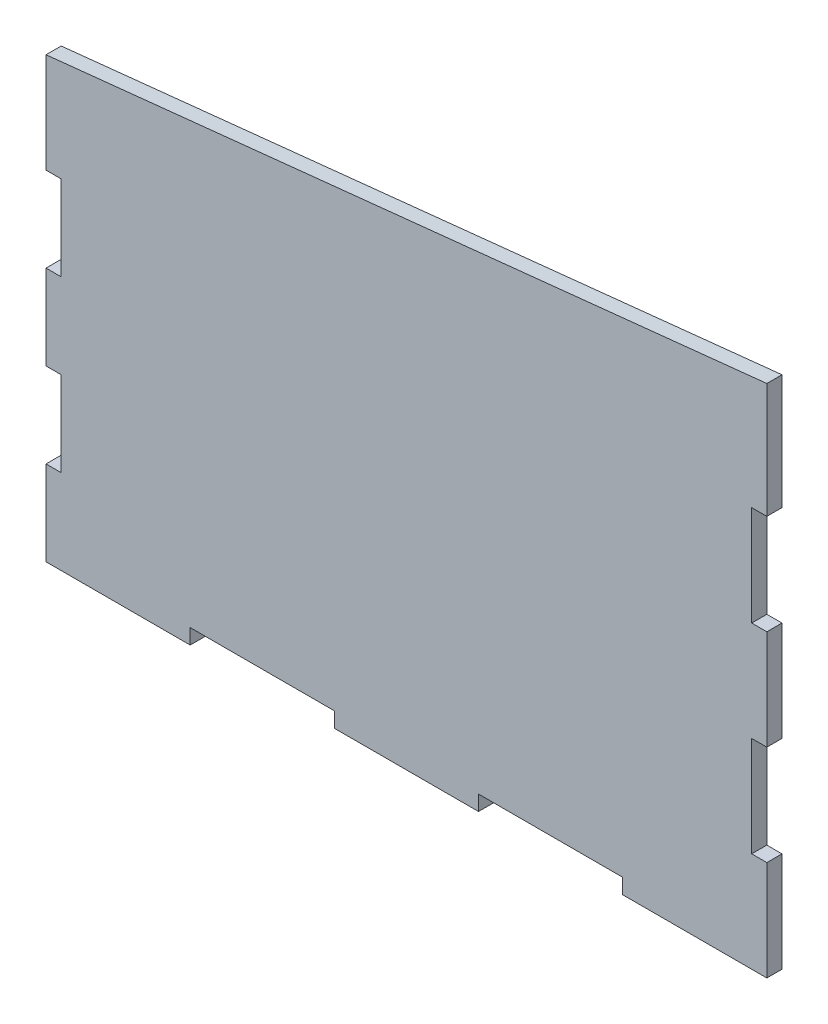
ISO-10303-21;
HEADER;
FILE_DESCRIPTION(('STEP AP214'),'2;1');
FILE_NAME('part.step','',(''),(''),'','','');
FILE_SCHEMA(('AUTOMOTIVE_DESIGN { 1 0 10303 214 1 1 1 1 }'));
ENDSEC;
DATA;
#1=APPLICATION_CONTEXT('core data for automotive mechanical design processes');
#2=APPLICATION_PROTOCOL_DEFINITION('international standard','automotive_design',2000,#1);
#3=PRODUCT_CONTEXT('',#1,'mechanical');
#4=PRODUCT('Part','Part','',(#3));
#5=PRODUCT_RELATED_PRODUCT_CATEGORY('part','',(#4));
#6=PRODUCT_DEFINITION_FORMATION('','',#4);
#7=PRODUCT_DEFINITION_CONTEXT('part definition',#1,'design');
#8=PRODUCT_DEFINITION('design','',#6,#7);
#9=PRODUCT_DEFINITION_SHAPE('','',#8);
#10=(LENGTH_UNIT() NAMED_UNIT(*) SI_UNIT(.MILLI.,.METRE.));
#11=(NAMED_UNIT(*) PLANE_ANGLE_UNIT() SI_UNIT($,.RADIAN.));
#12=(NAMED_UNIT(*) SI_UNIT($,.STERADIAN.) SOLID_ANGLE_UNIT());
#13=UNCERTAINTY_MEASURE_WITH_UNIT(LENGTH_MEASURE(1.E-05),#10,'distance_accuracy_value','');
#14=(GEOMETRIC_REPRESENTATION_CONTEXT(3) GLOBAL_UNCERTAINTY_ASSIGNED_CONTEXT((#13)) GLOBAL_UNIT_ASSIGNED_CONTEXT((#10,
#11,#12)) REPRESENTATION_CONTEXT('',''));
#15=CARTESIAN_POINT('',(0.,0.,0.));
#16=DIRECTION('',(0.,0.,1.));
#17=DIRECTION('',(1.,0.,0.));
#18=AXIS2_PLACEMENT_3D('',#15,#16,#17);
#19=CARTESIAN_POINT('',(0.,0.,5.));
#20=DIRECTION('',(1.,0.,0.));
#21=DIRECTION('',(0.,0.,-1.));
#22=AXIS2_PLACEMENT_3D('',#19,#20,#21);
#23=PLANE('',#22);
#24=DIRECTION('',(0.,-1.,0.));
#25=VECTOR('',#24,1.);
#26=CARTESIAN_POINT('',(0.,0.,0.));
#27=LINE('',#26,#25);
#28=CARTESIAN_POINT('',(0.,145.,0.));
#29=VERTEX_POINT('',#28);
#30=CARTESIAN_POINT('',(0.,112.,0.));
#31=VERTEX_POINT('',#30);
#32=EDGE_CURVE('E245',#29,#31,#27,.T.);
#33=ORIENTED_EDGE('',*,*,#32,.T.);
#34=DIRECTION('',(0.,0.,1.));
#35=VECTOR('',#34,1.);
#36=CARTESIAN_POINT('',(0.,112.,0.));
#37=LINE('',#36,#35);
#38=CARTESIAN_POINT('',(0.,112.,5.));
#39=VERTEX_POINT('',#38);
#40=EDGE_CURVE('E432',#31,#39,#37,.T.);
#41=ORIENTED_EDGE('',*,*,#40,.T.);
#42=DIRECTION('',(0.,-1.,0.));
#43=VECTOR('',#42,1.);
#44=CARTESIAN_POINT('',(0.,0.,5.));
#45=LINE('',#44,#43);
#46=CARTESIAN_POINT('',(0.,145.,5.));
#47=VERTEX_POINT('',#46);
#48=EDGE_CURVE('E258',#47,#39,#45,.T.);
#49=ORIENTED_EDGE('',*,*,#48,.F.);
#50=DIRECTION('',(0.,0.,-1.));
#51=VECTOR('',#50,1.);
#52=CARTESIAN_POINT('',(0.,145.,5.));
#53=LINE('',#52,#51);
#54=EDGE_CURVE('E257',#47,#29,#53,.T.);
#55=ORIENTED_EDGE('',*,*,#54,.T.);
#56=EDGE_LOOP('',(#33,#41,#49,#55));
#57=FACE_BOUND('',#56,.T.);
#58=ADVANCED_FACE('F35',(#57),#23,.F.);
#59=CARTESIAN_POINT('',(238.,0.,5.));
#60=DIRECTION('',(0.,1.,0.));
#61=DIRECTION('',(-1.,0.,0.));
#62=AXIS2_PLACEMENT_3D('',#59,#60,#61);
#63=PLANE('',#62);
#64=DIRECTION('',(1.,0.,0.));
#65=VECTOR('',#64,1.);
#66=CARTESIAN_POINT('',(238.,0.,0.));
#67=LINE('',#66,#65);
#68=CARTESIAN_POINT('',(0.,0.,0.));
#69=VERTEX_POINT('',#68);
#70=CARTESIAN_POINT('',(47.6,0.,0.));
#71=VERTEX_POINT('',#70);
#72=EDGE_CURVE('E282',#69,#71,#67,.T.);
#73=ORIENTED_EDGE('',*,*,#72,.T.);
#74=DIRECTION('',(0.,0.,1.));
#75=VECTOR('',#74,1.);
#76=CARTESIAN_POINT('',(47.6,0.,0.));
#77=LINE('',#76,#75);
#78=CARTESIAN_POINT('',(47.6,0.,5.));
#79=VERTEX_POINT('',#78);
#80=EDGE_CURVE('E336',#71,#79,#77,.T.);
#81=ORIENTED_EDGE('',*,*,#80,.T.);
#82=DIRECTION('',(1.,0.,0.));
#83=VECTOR('',#82,1.);
#84=CARTESIAN_POINT('',(238.,0.,5.));
#85=LINE('',#84,#83);
#86=CARTESIAN_POINT('',(0.,0.,5.));
#87=VERTEX_POINT('',#86);
#88=EDGE_CURVE('E308',#87,#79,#85,.T.);
#89=ORIENTED_EDGE('',*,*,#88,.F.);
#90=DIRECTION('',(0.,0.,-1.));
#91=VECTOR('',#90,1.);
#92=CARTESIAN_POINT('',(0.,0.,5.));
#93=LINE('',#92,#91);
#94=EDGE_CURVE('E254',#87,#69,#93,.T.);
#95=ORIENTED_EDGE('',*,*,#94,.T.);
#96=EDGE_LOOP('',(#73,#81,#89,#95));
#97=FACE_BOUND('',#96,.T.);
#98=ADVANCED_FACE('F335',(#97),#63,.F.);
#99=CARTESIAN_POINT('',(95.2,0.,5.));
#100=VERTEX_POINT('',#99);
#101=CARTESIAN_POINT('',(142.8,0.,5.));
#102=VERTEX_POINT('',#101);
#103=EDGE_CURVE('E312',#100,#102,#85,.T.);
#104=ORIENTED_EDGE('',*,*,#103,.F.);
#105=DIRECTION('',(0.,0.,1.));
#106=VECTOR('',#105,1.);
#107=CARTESIAN_POINT('',(95.2,0.,0.));
#108=LINE('',#107,#106);
#109=CARTESIAN_POINT('',(95.2,0.,0.));
#110=VERTEX_POINT('',#109);
#111=EDGE_CURVE('E340',#110,#100,#108,.T.);
#112=ORIENTED_EDGE('',*,*,#111,.F.);
#113=CARTESIAN_POINT('',(142.8,0.,0.));
#114=VERTEX_POINT('',#113);
#115=EDGE_CURVE('E285',#110,#114,#67,.T.);
#116=ORIENTED_EDGE('',*,*,#115,.T.);
#117=DIRECTION('',(0.,0.,1.));
#118=VECTOR('',#117,1.);
#119=CARTESIAN_POINT('',(142.8,0.,0.));
#120=LINE('',#119,#118);
#121=EDGE_CURVE('E358',#114,#102,#120,.T.);
#122=ORIENTED_EDGE('',*,*,#121,.T.);
#123=EDGE_LOOP('',(#104,#112,#116,#122));
#124=FACE_BOUND('',#123,.T.);
#125=ADVANCED_FACE('F477',(#124),#63,.F.);
#126=CARTESIAN_POINT('',(238.,170.,5.));
#127=DIRECTION('',(-1.,0.,0.));
#128=DIRECTION('',(0.,-1.,0.));
#129=AXIS2_PLACEMENT_3D('',#126,#127,#128);
#130=PLANE('',#129);
#131=DIRECTION('',(0.,1.,0.));
#132=VECTOR('',#131,1.);
#133=CARTESIAN_POINT('',(238.,170.,0.));
#134=LINE('',#133,#132);
#135=CARTESIAN_POINT('',(238.,66.,0.));
#136=VERTEX_POINT('',#135);
#137=CARTESIAN_POINT('',(238.,99.,0.));
#138=VERTEX_POINT('',#137);
#139=EDGE_CURVE('E276',#136,#138,#134,.T.);
#140=ORIENTED_EDGE('',*,*,#139,.T.);
#141=DIRECTION('',(0.,0.,1.));
#142=VECTOR('',#141,1.);
#143=CARTESIAN_POINT('',(238.,99.,0.));
#144=LINE('',#143,#142);
#145=CARTESIAN_POINT('',(238.,99.,5.));
#146=VERTEX_POINT('',#145);
#147=EDGE_CURVE('E362',#138,#146,#144,.T.);
#148=ORIENTED_EDGE('',*,*,#147,.T.);
#149=DIRECTION('',(0.,1.,0.));
#150=VECTOR('',#149,1.);
#151=CARTESIAN_POINT('',(238.,5.00000000000005,5.));
#152=LINE('',#151,#150);
#153=CARTESIAN_POINT('',(238.,66.,5.));
#154=VERTEX_POINT('',#153);
#155=EDGE_CURVE('E316',#154,#146,#152,.T.);
#156=ORIENTED_EDGE('',*,*,#155,.F.);
#157=DIRECTION('',(0.,0.,1.));
#158=VECTOR('',#157,1.);
#159=CARTESIAN_POINT('',(238.,66.,0.));
#160=LINE('',#159,#158);
#161=EDGE_CURVE('E420',#136,#154,#160,.T.);
#162=ORIENTED_EDGE('',*,*,#161,.F.);
#163=EDGE_LOOP('',(#140,#148,#156,#162));
#164=FACE_BOUND('',#163,.T.);
#165=ADVANCED_FACE('F490',(#164),#130,.F.);
#166=CARTESIAN_POINT('',(238.,132.,5.));
#167=VERTEX_POINT('',#166);
#168=CARTESIAN_POINT('',(238.,170.,5.));
#169=VERTEX_POINT('',#168);
#170=EDGE_CURVE('E311',#167,#169,#152,.T.);
#171=ORIENTED_EDGE('',*,*,#170,.F.);
#172=DIRECTION('',(0.,0.,1.));
#173=VECTOR('',#172,1.);
#174=CARTESIAN_POINT('',(238.,132.,0.));
#175=LINE('',#174,#173);
#176=CARTESIAN_POINT('',(238.,132.,0.));
#177=VERTEX_POINT('',#176);
#178=EDGE_CURVE('E385',#177,#167,#175,.T.);
#179=ORIENTED_EDGE('',*,*,#178,.F.);
#180=CARTESIAN_POINT('',(238.,170.,0.));
#181=VERTEX_POINT('',#180);
#182=EDGE_CURVE('E273',#177,#181,#134,.T.);
#183=ORIENTED_EDGE('',*,*,#182,.T.);
#184=DIRECTION('',(0.,0.,-1.));
#185=VECTOR('',#184,1.);
#186=CARTESIAN_POINT('',(238.,170.,5.));
#187=LINE('',#186,#185);
#188=EDGE_CURVE('E43',#169,#181,#187,.T.);
#189=ORIENTED_EDGE('',*,*,#188,.F.);
#190=EDGE_LOOP('',(#171,#179,#183,#189));
#191=FACE_BOUND('',#190,.T.);
#192=ADVANCED_FACE('F491',(#191),#130,.F.);
#193=CARTESIAN_POINT('',(0.,84.,5.));
#194=VERTEX_POINT('',#193);
#195=CARTESIAN_POINT('',(0.,56.,5.));
#196=VERTEX_POINT('',#195);
#197=EDGE_CURVE('E236',#194,#196,#45,.T.);
#198=ORIENTED_EDGE('',*,*,#197,.F.);
#199=DIRECTION('',(0.,0.,1.));
#200=VECTOR('',#199,1.);
#201=CARTESIAN_POINT('',(0.,84.,0.));
#202=LINE('',#201,#200);
#203=CARTESIAN_POINT('',(0.,84.,0.));
#204=VERTEX_POINT('',#203);
#205=EDGE_CURVE('E223',#204,#194,#202,.T.);
#206=ORIENTED_EDGE('',*,*,#205,.F.);
#207=CARTESIAN_POINT('',(0.,56.,0.));
#208=VERTEX_POINT('',#207);
#209=EDGE_CURVE('E234',#204,#208,#27,.T.);
#210=ORIENTED_EDGE('',*,*,#209,.T.);
#211=DIRECTION('',(0.,0.,1.));
#212=VECTOR('',#211,1.);
#213=CARTESIAN_POINT('',(0.,56.,0.));
#214=LINE('',#213,#212);
#215=EDGE_CURVE('E292',#208,#196,#214,.T.);
#216=ORIENTED_EDGE('',*,*,#215,.T.);
#217=EDGE_LOOP('',(#198,#206,#210,#216));
#218=FACE_BOUND('',#217,.T.);
#219=ADVANCED_FACE('F232',(#218),#23,.F.);
#220=CARTESIAN_POINT('',(190.4,0.,5.));
#221=VERTEX_POINT('',#220);
#222=CARTESIAN_POINT('',(238.,0.,5.));
#223=VERTEX_POINT('',#222);
#224=EDGE_CURVE('E249',#221,#223,#85,.T.);
#225=ORIENTED_EDGE('',*,*,#224,.F.);
#226=DIRECTION('',(0.,0.,1.));
#227=VECTOR('',#226,1.);
#228=CARTESIAN_POINT('',(190.4,0.,0.));
#229=LINE('',#228,#227);
#230=CARTESIAN_POINT('',(190.4,0.,0.));
#231=VERTEX_POINT('',#230);
#232=EDGE_CURVE('E372',#231,#221,#229,.T.);
#233=ORIENTED_EDGE('',*,*,#232,.F.);
#234=CARTESIAN_POINT('',(238.,0.,0.));
#235=VERTEX_POINT('',#234);
#236=EDGE_CURVE('E286',#231,#235,#67,.T.);
#237=ORIENTED_EDGE('',*,*,#236,.T.);
#238=DIRECTION('',(0.,0.,-1.));
#239=VECTOR('',#238,1.);
#240=CARTESIAN_POINT('',(238.,0.,5.));
#241=LINE('',#240,#239);
#242=EDGE_CURVE('E11',#223,#235,#241,.T.);
#243=ORIENTED_EDGE('',*,*,#242,.F.);
#244=EDGE_LOOP('',(#225,#233,#237,#243));
#245=FACE_BOUND('',#244,.T.);
#246=ADVANCED_FACE('F37',(#245),#63,.F.);
#247=CARTESIAN_POINT('',(238.,33.,0.));
#248=VERTEX_POINT('',#247);
#249=EDGE_CURVE('E274',#235,#248,#134,.T.);
#250=ORIENTED_EDGE('',*,*,#249,.T.);
#251=DIRECTION('',(0.,0.,1.));
#252=VECTOR('',#251,1.);
#253=CARTESIAN_POINT('',(238.,33.,0.));
#254=LINE('',#253,#252);
#255=CARTESIAN_POINT('',(238.,33.,5.));
#256=VERTEX_POINT('',#255);
#257=EDGE_CURVE('E422',#248,#256,#254,.T.);
#258=ORIENTED_EDGE('',*,*,#257,.T.);
#259=EDGE_CURVE('E313',#223,#256,#152,.T.);
#260=ORIENTED_EDGE('',*,*,#259,.F.);
#261=ORIENTED_EDGE('',*,*,#242,.T.);
#262=EDGE_LOOP('',(#250,#258,#260,#261));
#263=FACE_BOUND('',#262,.T.);
#264=ADVANCED_FACE('F484',(#263),#130,.F.);
#265=CARTESIAN_POINT('',(0.,145.,5.));
#266=DIRECTION('',(0.10446726114149,-0.994528326066983,0.));
#267=DIRECTION('',(0.994528326066983,0.10446726114149,0.));
#268=AXIS2_PLACEMENT_3D('',#265,#266,#267);
#269=PLANE('',#268);
#270=DIRECTION('',(-0.994528326066983,-0.10446726114149,0.));
#271=VECTOR('',#270,1.);
#272=CARTESIAN_POINT('',(0.,145.,0.));
#273=LINE('',#272,#271);
#274=EDGE_CURVE('E250',#181,#29,#273,.T.);
#275=ORIENTED_EDGE('',*,*,#274,.T.);
#276=ORIENTED_EDGE('',*,*,#54,.F.);
#277=DIRECTION('',(-0.994528326066983,-0.10446726114149,0.));
#278=VECTOR('',#277,1.);
#279=CARTESIAN_POINT('',(0.,145.,5.));
#280=LINE('',#279,#278);
#281=EDGE_CURVE('E267',#169,#47,#280,.T.);
#282=ORIENTED_EDGE('',*,*,#281,.F.);
#283=ORIENTED_EDGE('',*,*,#188,.T.);
#284=EDGE_LOOP('',(#275,#276,#282,#283));
#285=FACE_BOUND('',#284,.T.);
#286=ADVANCED_FACE('F265',(#285),#269,.F.);
#287=CARTESIAN_POINT('',(0.,28.,5.));
#288=VERTEX_POINT('',#287);
#289=EDGE_CURVE('E317',#288,#87,#45,.T.);
#290=ORIENTED_EDGE('',*,*,#289,.F.);
#291=DIRECTION('',(0.,0.,1.));
#292=VECTOR('',#291,1.);
#293=CARTESIAN_POINT('',(0.,28.,0.));
#294=LINE('',#293,#292);
#295=CARTESIAN_POINT('',(0.,28.,0.));
#296=VERTEX_POINT('',#295);
#297=EDGE_CURVE('E306',#296,#288,#294,.T.);
#298=ORIENTED_EDGE('',*,*,#297,.F.);
#299=EDGE_CURVE('E246',#296,#69,#27,.T.);
#300=ORIENTED_EDGE('',*,*,#299,.T.);
#301=ORIENTED_EDGE('',*,*,#94,.F.);
#302=EDGE_LOOP('',(#290,#298,#300,#301));
#303=FACE_BOUND('',#302,.T.);
#304=ADVANCED_FACE('F333',(#303),#23,.F.);
#305=CARTESIAN_POINT('',(0.,0.,5.));
#306=DIRECTION('',(0.,0.,-1.));
#307=DIRECTION('',(-1.,0.,0.));
#308=AXIS2_PLACEMENT_3D('',#305,#306,#307);
#309=PLANE('',#308);
#310=ORIENTED_EDGE('',*,*,#48,.T.);
#311=DIRECTION('',(-1.,0.,0.));
#312=VECTOR('',#311,1.);
#313=CARTESIAN_POINT('',(0.,112.,5.));
#314=LINE('',#313,#312);
#315=CARTESIAN_POINT('',(5.,112.,5.));
#316=VERTEX_POINT('',#315);
#317=EDGE_CURVE('E228',#316,#39,#314,.T.);
#318=ORIENTED_EDGE('',*,*,#317,.F.);
#319=DIRECTION('',(0.,1.,0.));
#320=VECTOR('',#319,1.);
#321=CARTESIAN_POINT('',(5.,84.,5.));
#322=LINE('',#321,#320);
#323=CARTESIAN_POINT('',(5.,84.,5.));
#324=VERTEX_POINT('',#323);
#325=EDGE_CURVE('E442',#324,#316,#322,.T.);
#326=ORIENTED_EDGE('',*,*,#325,.F.);
#327=DIRECTION('',(1.,0.,0.));
#328=VECTOR('',#327,1.);
#329=CARTESIAN_POINT('',(0.,84.,5.));
#330=LINE('',#329,#328);
#331=EDGE_CURVE('E440',#194,#324,#330,.T.);
#332=ORIENTED_EDGE('',*,*,#331,.F.);
#333=ORIENTED_EDGE('',*,*,#197,.T.);
#334=DIRECTION('',(-1.,0.,0.));
#335=VECTOR('',#334,1.);
#336=CARTESIAN_POINT('',(0.,56.,5.));
#337=LINE('',#336,#335);
#338=CARTESIAN_POINT('',(5.,56.,5.));
#339=VERTEX_POINT('',#338);
#340=EDGE_CURVE('E302',#339,#196,#337,.T.);
#341=ORIENTED_EDGE('',*,*,#340,.F.);
#342=DIRECTION('',(0.,1.,0.));
#343=VECTOR('',#342,1.);
#344=CARTESIAN_POINT('',(5.,28.,5.));
#345=LINE('',#344,#343);
#346=CARTESIAN_POINT('',(5.,28.,5.));
#347=VERTEX_POINT('',#346);
#348=EDGE_CURVE('E431',#347,#339,#345,.T.);
#349=ORIENTED_EDGE('',*,*,#348,.F.);
#350=DIRECTION('',(1.,0.,0.));
#351=VECTOR('',#350,1.);
#352=CARTESIAN_POINT('',(0.,28.,5.));
#353=LINE('',#352,#351);
#354=EDGE_CURVE('E330',#288,#347,#353,.T.);
#355=ORIENTED_EDGE('',*,*,#354,.F.);
#356=ORIENTED_EDGE('',*,*,#289,.T.);
#357=ORIENTED_EDGE('',*,*,#88,.T.);
#358=DIRECTION('',(0.,-1.,0.));
#359=VECTOR('',#358,1.);
#360=CARTESIAN_POINT('',(47.6,0.,5.));
#361=LINE('',#360,#359);
#362=CARTESIAN_POINT('',(47.6,5.,5.));
#363=VERTEX_POINT('',#362);
#364=EDGE_CURVE('E369',#363,#79,#361,.T.);
#365=ORIENTED_EDGE('',*,*,#364,.F.);
#366=DIRECTION('',(-1.,0.,0.));
#367=VECTOR('',#366,1.);
#368=CARTESIAN_POINT('',(47.6,5.,5.));
#369=LINE('',#368,#367);
#370=CARTESIAN_POINT('',(95.2,5.,5.));
#371=VERTEX_POINT('',#370);
#372=EDGE_CURVE('E458',#371,#363,#369,.T.);
#373=ORIENTED_EDGE('',*,*,#372,.F.);
#374=DIRECTION('',(0.,1.,0.));
#375=VECTOR('',#374,1.);
#376=CARTESIAN_POINT('',(95.2,0.,5.));
#377=LINE('',#376,#375);
#378=EDGE_CURVE('E462',#100,#371,#377,.T.);
#379=ORIENTED_EDGE('',*,*,#378,.F.);
#380=ORIENTED_EDGE('',*,*,#103,.T.);
#381=DIRECTION('',(0.,-1.,0.));
#382=VECTOR('',#381,1.);
#383=CARTESIAN_POINT('',(142.8,0.,5.));
#384=LINE('',#383,#382);
#385=CARTESIAN_POINT('',(142.8,5.,5.));
#386=VERTEX_POINT('',#385);
#387=EDGE_CURVE('E359',#386,#102,#384,.T.);
#388=ORIENTED_EDGE('',*,*,#387,.F.);
#389=DIRECTION('',(-1.,0.,0.));
#390=VECTOR('',#389,1.);
#391=CARTESIAN_POINT('',(142.8,5.,5.));
#392=LINE('',#391,#390);
#393=CARTESIAN_POINT('',(190.4,5.,5.));
#394=VERTEX_POINT('',#393);
#395=EDGE_CURVE('E352',#394,#386,#392,.T.);
#396=ORIENTED_EDGE('',*,*,#395,.F.);
#397=DIRECTION('',(0.,1.,0.));
#398=VECTOR('',#397,1.);
#399=CARTESIAN_POINT('',(190.4,0.,5.));
#400=LINE('',#399,#398);
#401=EDGE_CURVE('E361',#221,#394,#400,.T.);
#402=ORIENTED_EDGE('',*,*,#401,.F.);
#403=ORIENTED_EDGE('',*,*,#224,.T.);
#404=ORIENTED_EDGE('',*,*,#259,.T.);
#405=DIRECTION('',(1.,0.,0.));
#406=VECTOR('',#405,1.);
#407=CARTESIAN_POINT('',(233.,33.,5.));
#408=LINE('',#407,#406);
#409=CARTESIAN_POINT('',(233.,33.,5.));
#410=VERTEX_POINT('',#409);
#411=EDGE_CURVE('E415',#410,#256,#408,.T.);
#412=ORIENTED_EDGE('',*,*,#411,.F.);
#413=DIRECTION('',(0.,-1.,0.));
#414=VECTOR('',#413,1.);
#415=CARTESIAN_POINT('',(233.,33.,5.));
#416=LINE('',#415,#414);
#417=CARTESIAN_POINT('',(233.,66.,5.));
#418=VERTEX_POINT('',#417);
#419=EDGE_CURVE('E412',#418,#410,#416,.T.);
#420=ORIENTED_EDGE('',*,*,#419,.F.);
#421=DIRECTION('',(-1.,0.,0.));
#422=VECTOR('',#421,1.);
#423=CARTESIAN_POINT('',(233.,66.,5.));
#424=LINE('',#423,#422);
#425=EDGE_CURVE('E405',#154,#418,#424,.T.);
#426=ORIENTED_EDGE('',*,*,#425,.F.);
#427=ORIENTED_EDGE('',*,*,#155,.T.);
#428=DIRECTION('',(1.,0.,0.));
#429=VECTOR('',#428,1.);
#430=CARTESIAN_POINT('',(238.,99.,5.));
#431=LINE('',#430,#429);
#432=CARTESIAN_POINT('',(233.,99.,5.));
#433=VERTEX_POINT('',#432);
#434=EDGE_CURVE('E379',#433,#146,#431,.T.);
#435=ORIENTED_EDGE('',*,*,#434,.F.);
#436=DIRECTION('',(0.,-1.,0.));
#437=VECTOR('',#436,1.);
#438=CARTESIAN_POINT('',(233.,132.,5.));
#439=LINE('',#438,#437);
#440=CARTESIAN_POINT('',(233.,132.,5.));
#441=VERTEX_POINT('',#440);
#442=EDGE_CURVE('E389',#441,#433,#439,.T.);
#443=ORIENTED_EDGE('',*,*,#442,.F.);
#444=DIRECTION('',(-1.,0.,0.));
#445=VECTOR('',#444,1.);
#446=CARTESIAN_POINT('',(238.,132.,5.));
#447=LINE('',#446,#445);
#448=EDGE_CURVE('E386',#167,#441,#447,.T.);
#449=ORIENTED_EDGE('',*,*,#448,.F.);
#450=ORIENTED_EDGE('',*,*,#170,.T.);
#451=ORIENTED_EDGE('',*,*,#281,.T.);
#452=EDGE_LOOP('',(#310,#318,#326,#332,#333,#341,#349,#355,#356,#357,#365,#373,#379,#380,#388,
#396,#402,#403,#404,#412,#420,#426,#427,#435,#443,#449,#450,#451));
#453=FACE_BOUND('',#452,.T.);
#454=ADVANCED_FACE('F325',(#453),#309,.F.);
#455=CARTESIAN_POINT('',(0.,0.,0.));
#456=DIRECTION('',(0.,0.,-1.));
#457=DIRECTION('',(-1.,0.,0.));
#458=AXIS2_PLACEMENT_3D('',#455,#456,#457);
#459=PLANE('',#458);
#460=DIRECTION('',(-1.,0.,0.));
#461=VECTOR('',#460,1.);
#462=CARTESIAN_POINT('',(0.,112.,0.));
#463=LINE('',#462,#461);
#464=CARTESIAN_POINT('',(5.,112.,0.));
#465=VERTEX_POINT('',#464);
#466=EDGE_CURVE('E237',#465,#31,#463,.T.);
#467=ORIENTED_EDGE('',*,*,#466,.T.);
#468=ORIENTED_EDGE('',*,*,#32,.F.);
#469=ORIENTED_EDGE('',*,*,#274,.F.);
#470=ORIENTED_EDGE('',*,*,#182,.F.);
#471=DIRECTION('',(-1.,0.,0.));
#472=VECTOR('',#471,1.);
#473=CARTESIAN_POINT('',(238.,132.,0.));
#474=LINE('',#473,#472);
#475=CARTESIAN_POINT('',(233.,132.,0.));
#476=VERTEX_POINT('',#475);
#477=EDGE_CURVE('E376',#177,#476,#474,.T.);
#478=ORIENTED_EDGE('',*,*,#477,.T.);
#479=DIRECTION('',(0.,-1.,0.));
#480=VECTOR('',#479,1.);
#481=CARTESIAN_POINT('',(233.,132.,0.));
#482=LINE('',#481,#480);
#483=CARTESIAN_POINT('',(233.,99.,0.));
#484=VERTEX_POINT('',#483);
#485=EDGE_CURVE('E378',#476,#484,#482,.T.);
#486=ORIENTED_EDGE('',*,*,#485,.T.);
#487=DIRECTION('',(1.,0.,0.));
#488=VECTOR('',#487,1.);
#489=CARTESIAN_POINT('',(238.,99.,0.));
#490=LINE('',#489,#488);
#491=EDGE_CURVE('E382',#484,#138,#490,.T.);
#492=ORIENTED_EDGE('',*,*,#491,.T.);
#493=ORIENTED_EDGE('',*,*,#139,.F.);
#494=DIRECTION('',(-1.,0.,0.));
#495=VECTOR('',#494,1.);
#496=CARTESIAN_POINT('',(233.,66.,0.));
#497=LINE('',#496,#495);
#498=CARTESIAN_POINT('',(233.,66.,0.));
#499=VERTEX_POINT('',#498);
#500=EDGE_CURVE('E408',#136,#499,#497,.T.);
#501=ORIENTED_EDGE('',*,*,#500,.T.);
#502=DIRECTION('',(0.,-1.,0.));
#503=VECTOR('',#502,1.);
#504=CARTESIAN_POINT('',(233.,33.,0.));
#505=LINE('',#504,#503);
#506=CARTESIAN_POINT('',(233.,33.,0.));
#507=VERTEX_POINT('',#506);
#508=EDGE_CURVE('E401',#499,#507,#505,.T.);
#509=ORIENTED_EDGE('',*,*,#508,.T.);
#510=DIRECTION('',(1.,0.,0.));
#511=VECTOR('',#510,1.);
#512=CARTESIAN_POINT('',(233.,33.,0.));
#513=LINE('',#512,#511);
#514=EDGE_CURVE('E404',#507,#248,#513,.T.);
#515=ORIENTED_EDGE('',*,*,#514,.T.);
#516=ORIENTED_EDGE('',*,*,#249,.F.);
#517=ORIENTED_EDGE('',*,*,#236,.F.);
#518=DIRECTION('',(0.,1.,0.));
#519=VECTOR('',#518,1.);
#520=CARTESIAN_POINT('',(190.4,0.,0.));
#521=LINE('',#520,#519);
#522=CARTESIAN_POINT('',(190.4,5.,0.));
#523=VERTEX_POINT('',#522);
#524=EDGE_CURVE('E351',#231,#523,#521,.T.);
#525=ORIENTED_EDGE('',*,*,#524,.T.);
#526=DIRECTION('',(-1.,0.,0.));
#527=VECTOR('',#526,1.);
#528=CARTESIAN_POINT('',(142.8,5.,0.));
#529=LINE('',#528,#527);
#530=CARTESIAN_POINT('',(142.8,5.,0.));
#531=VERTEX_POINT('',#530);
#532=EDGE_CURVE('E355',#523,#531,#529,.T.);
#533=ORIENTED_EDGE('',*,*,#532,.T.);
#534=DIRECTION('',(0.,-1.,0.));
#535=VECTOR('',#534,1.);
#536=CARTESIAN_POINT('',(142.8,0.,0.));
#537=LINE('',#536,#535);
#538=EDGE_CURVE('E348',#531,#114,#537,.T.);
#539=ORIENTED_EDGE('',*,*,#538,.T.);
#540=ORIENTED_EDGE('',*,*,#115,.F.);
#541=DIRECTION('',(0.,1.,0.));
#542=VECTOR('',#541,1.);
#543=CARTESIAN_POINT('',(95.2,0.,0.));
#544=LINE('',#543,#542);
#545=CARTESIAN_POINT('',(95.2,5.,0.));
#546=VERTEX_POINT('',#545);
#547=EDGE_CURVE('E344',#110,#546,#544,.T.);
#548=ORIENTED_EDGE('',*,*,#547,.T.);
#549=DIRECTION('',(-1.,0.,0.));
#550=VECTOR('',#549,1.);
#551=CARTESIAN_POINT('',(47.6,5.,0.));
#552=LINE('',#551,#550);
#553=CARTESIAN_POINT('',(47.6,5.,0.));
#554=VERTEX_POINT('',#553);
#555=EDGE_CURVE('E58',#546,#554,#552,.T.);
#556=ORIENTED_EDGE('',*,*,#555,.T.);
#557=DIRECTION('',(0.,-1.,0.));
#558=VECTOR('',#557,1.);
#559=CARTESIAN_POINT('',(47.6,0.,0.));
#560=LINE('',#559,#558);
#561=EDGE_CURVE('E456',#554,#71,#560,.T.);
#562=ORIENTED_EDGE('',*,*,#561,.T.);
#563=ORIENTED_EDGE('',*,*,#72,.F.);
#564=ORIENTED_EDGE('',*,*,#299,.F.);
#565=DIRECTION('',(1.,0.,0.));
#566=VECTOR('',#565,1.);
#567=CARTESIAN_POINT('',(0.,28.,0.));
#568=LINE('',#567,#566);
#569=CARTESIAN_POINT('',(5.,28.,0.));
#570=VERTEX_POINT('',#569);
#571=EDGE_CURVE('E425',#296,#570,#568,.T.);
#572=ORIENTED_EDGE('',*,*,#571,.T.);
#573=DIRECTION('',(0.,1.,0.));
#574=VECTOR('',#573,1.);
#575=CARTESIAN_POINT('',(5.,28.,0.));
#576=LINE('',#575,#574);
#577=CARTESIAN_POINT('',(5.,56.,0.));
#578=VERTEX_POINT('',#577);
#579=EDGE_CURVE('E428',#570,#578,#576,.T.);
#580=ORIENTED_EDGE('',*,*,#579,.T.);
#581=DIRECTION('',(-1.,0.,0.));
#582=VECTOR('',#581,1.);
#583=CARTESIAN_POINT('',(0.,56.,0.));
#584=LINE('',#583,#582);
#585=EDGE_CURVE('E244',#578,#208,#584,.T.);
#586=ORIENTED_EDGE('',*,*,#585,.T.);
#587=ORIENTED_EDGE('',*,*,#209,.F.);
#588=DIRECTION('',(1.,0.,0.));
#589=VECTOR('',#588,1.);
#590=CARTESIAN_POINT('',(0.,84.,0.));
#591=LINE('',#590,#589);
#592=CARTESIAN_POINT('',(5.,84.,0.));
#593=VERTEX_POINT('',#592);
#594=EDGE_CURVE('E219',#204,#593,#591,.T.);
#595=ORIENTED_EDGE('',*,*,#594,.T.);
#596=DIRECTION('',(0.,1.,0.));
#597=VECTOR('',#596,1.);
#598=CARTESIAN_POINT('',(5.,84.,0.));
#599=LINE('',#598,#597);
#600=EDGE_CURVE('E50',#593,#465,#599,.T.);
#601=ORIENTED_EDGE('',*,*,#600,.T.);
#602=EDGE_LOOP('',(#467,#468,#469,#470,#478,#486,#492,#493,#501,#509,#515,#516,#517,#525,#533,
#539,#540,#548,#556,#562,#563,#564,#572,#580,#586,#587,#595,#601));
#603=FACE_BOUND('',#602,.T.);
#604=ADVANCED_FACE('F241',(#603),#459,.T.);
#605=CARTESIAN_POINT('',(0.,56.,0.));
#606=DIRECTION('',(0.,1.,0.));
#607=DIRECTION('',(0.,0.,1.));
#608=AXIS2_PLACEMENT_3D('',#605,#606,#607);
#609=PLANE('',#608);
#610=ORIENTED_EDGE('',*,*,#340,.T.);
#611=ORIENTED_EDGE('',*,*,#215,.F.);
#612=ORIENTED_EDGE('',*,*,#585,.F.);
#613=DIRECTION('',(0.,0.,1.));
#614=VECTOR('',#613,1.);
#615=CARTESIAN_POINT('',(5.,56.,0.));
#616=LINE('',#615,#614);
#617=EDGE_CURVE('E297',#578,#339,#616,.T.);
#618=ORIENTED_EDGE('',*,*,#617,.T.);
#619=EDGE_LOOP('',(#610,#611,#612,#618));
#620=FACE_BOUND('',#619,.T.);
#621=ADVANCED_FACE('F438',(#620),#609,.F.);
#622=CARTESIAN_POINT('',(5.,28.,0.));
#623=DIRECTION('',(1.,0.,0.));
#624=DIRECTION('',(0.,0.,-1.));
#625=AXIS2_PLACEMENT_3D('',#622,#623,#624);
#626=PLANE('',#625);
#627=ORIENTED_EDGE('',*,*,#348,.T.);
#628=ORIENTED_EDGE('',*,*,#617,.F.);
#629=ORIENTED_EDGE('',*,*,#579,.F.);
#630=DIRECTION('',(0.,0.,1.));
#631=VECTOR('',#630,1.);
#632=CARTESIAN_POINT('',(5.,28.,0.));
#633=LINE('',#632,#631);
#634=EDGE_CURVE('E299',#570,#347,#633,.T.);
#635=ORIENTED_EDGE('',*,*,#634,.T.);
#636=EDGE_LOOP('',(#627,#628,#629,#635));
#637=FACE_BOUND('',#636,.T.);
#638=ADVANCED_FACE('F544',(#637),#626,.F.);
#639=CARTESIAN_POINT('',(0.,28.,0.));
#640=DIRECTION('',(0.,-1.,0.));
#641=DIRECTION('',(0.,0.,-1.));
#642=AXIS2_PLACEMENT_3D('',#639,#640,#641);
#643=PLANE('',#642);
#644=ORIENTED_EDGE('',*,*,#354,.T.);
#645=ORIENTED_EDGE('',*,*,#634,.F.);
#646=ORIENTED_EDGE('',*,*,#571,.F.);
#647=ORIENTED_EDGE('',*,*,#297,.T.);
#648=EDGE_LOOP('',(#644,#645,#646,#647));
#649=FACE_BOUND('',#648,.T.);
#650=ADVANCED_FACE('F554',(#649),#643,.F.);
#651=CARTESIAN_POINT('',(233.,33.,0.));
#652=DIRECTION('',(-1.,0.,0.));
#653=DIRECTION('',(0.,0.,1.));
#654=AXIS2_PLACEMENT_3D('',#651,#652,#653);
#655=PLANE('',#654);
#656=ORIENTED_EDGE('',*,*,#419,.T.);
#657=DIRECTION('',(0.,0.,1.));
#658=VECTOR('',#657,1.);
#659=CARTESIAN_POINT('',(233.,33.,0.));
#660=LINE('',#659,#658);
#661=EDGE_CURVE('E411',#507,#410,#660,.T.);
#662=ORIENTED_EDGE('',*,*,#661,.F.);
#663=ORIENTED_EDGE('',*,*,#508,.F.);
#664=DIRECTION('',(0.,0.,1.));
#665=VECTOR('',#664,1.);
#666=CARTESIAN_POINT('',(233.,66.,0.));
#667=LINE('',#666,#665);
#668=EDGE_CURVE('E390',#499,#418,#667,.T.);
#669=ORIENTED_EDGE('',*,*,#668,.T.);
#670=EDGE_LOOP('',(#656,#662,#663,#669));
#671=FACE_BOUND('',#670,.T.);
#672=ADVANCED_FACE('F563',(#671),#655,.F.);
#673=CARTESIAN_POINT('',(233.,66.,0.));
#674=DIRECTION('',(0.,1.,0.));
#675=DIRECTION('',(0.,0.,1.));
#676=AXIS2_PLACEMENT_3D('',#673,#674,#675);
#677=PLANE('',#676);
#678=ORIENTED_EDGE('',*,*,#425,.T.);
#679=ORIENTED_EDGE('',*,*,#668,.F.);
#680=ORIENTED_EDGE('',*,*,#500,.F.);
#681=ORIENTED_EDGE('',*,*,#161,.T.);
#682=EDGE_LOOP('',(#678,#679,#680,#681));
#683=FACE_BOUND('',#682,.T.);
#684=ADVANCED_FACE('F573',(#683),#677,.F.);
#685=CARTESIAN_POINT('',(233.,33.,0.));
#686=DIRECTION('',(0.,-1.,0.));
#687=DIRECTION('',(0.,0.,-1.));
#688=AXIS2_PLACEMENT_3D('',#685,#686,#687);
#689=PLANE('',#688);
#690=ORIENTED_EDGE('',*,*,#411,.T.);
#691=ORIENTED_EDGE('',*,*,#257,.F.);
#692=ORIENTED_EDGE('',*,*,#514,.F.);
#693=ORIENTED_EDGE('',*,*,#661,.T.);
#694=EDGE_LOOP('',(#690,#691,#692,#693));
#695=FACE_BOUND('',#694,.T.);
#696=ADVANCED_FACE('F583',(#695),#689,.F.);
#697=CARTESIAN_POINT('',(238.,99.,0.));
#698=DIRECTION('',(0.,-1.,0.));
#699=DIRECTION('',(0.,0.,-1.));
#700=AXIS2_PLACEMENT_3D('',#697,#698,#699);
#701=PLANE('',#700);
#702=ORIENTED_EDGE('',*,*,#434,.T.);
#703=ORIENTED_EDGE('',*,*,#147,.F.);
#704=ORIENTED_EDGE('',*,*,#491,.F.);
#705=DIRECTION('',(0.,0.,1.));
#706=VECTOR('',#705,1.);
#707=CARTESIAN_POINT('',(233.,99.,0.));
#708=LINE('',#707,#706);
#709=EDGE_CURVE('E396',#484,#433,#708,.T.);
#710=ORIENTED_EDGE('',*,*,#709,.T.);
#711=EDGE_LOOP('',(#702,#703,#704,#710));
#712=FACE_BOUND('',#711,.T.);
#713=ADVANCED_FACE('F593',(#712),#701,.F.);
#714=CARTESIAN_POINT('',(233.,132.,0.));
#715=DIRECTION('',(-1.,0.,0.));
#716=DIRECTION('',(0.,0.,1.));
#717=AXIS2_PLACEMENT_3D('',#714,#715,#716);
#718=PLANE('',#717);
#719=ORIENTED_EDGE('',*,*,#442,.T.);
#720=ORIENTED_EDGE('',*,*,#709,.F.);
#721=ORIENTED_EDGE('',*,*,#485,.F.);
#722=DIRECTION('',(0.,0.,1.));
#723=VECTOR('',#722,1.);
#724=CARTESIAN_POINT('',(233.,132.,0.));
#725=LINE('',#724,#723);
#726=EDGE_CURVE('E398',#476,#441,#725,.T.);
#727=ORIENTED_EDGE('',*,*,#726,.T.);
#728=EDGE_LOOP('',(#719,#720,#721,#727));
#729=FACE_BOUND('',#728,.T.);
#730=ADVANCED_FACE('F603',(#729),#718,.F.);
#731=CARTESIAN_POINT('',(238.,132.,0.));
#732=DIRECTION('',(0.,1.,0.));
#733=DIRECTION('',(0.,0.,1.));
#734=AXIS2_PLACEMENT_3D('',#731,#732,#733);
#735=PLANE('',#734);
#736=ORIENTED_EDGE('',*,*,#448,.T.);
#737=ORIENTED_EDGE('',*,*,#726,.F.);
#738=ORIENTED_EDGE('',*,*,#477,.F.);
#739=ORIENTED_EDGE('',*,*,#178,.T.);
#740=EDGE_LOOP('',(#736,#737,#738,#739));
#741=FACE_BOUND('',#740,.T.);
#742=ADVANCED_FACE('F613',(#741),#735,.F.);
#743=CARTESIAN_POINT('',(142.8,0.,0.));
#744=DIRECTION('',(-1.,0.,0.));
#745=DIRECTION('',(0.,0.,1.));
#746=AXIS2_PLACEMENT_3D('',#743,#744,#745);
#747=PLANE('',#746);
#748=ORIENTED_EDGE('',*,*,#387,.T.);
#749=ORIENTED_EDGE('',*,*,#121,.F.);
#750=ORIENTED_EDGE('',*,*,#538,.F.);
#751=DIRECTION('',(0.,0.,1.));
#752=VECTOR('',#751,1.);
#753=CARTESIAN_POINT('',(142.8,5.,0.));
#754=LINE('',#753,#752);
#755=EDGE_CURVE('E367',#531,#386,#754,.T.);
#756=ORIENTED_EDGE('',*,*,#755,.T.);
#757=EDGE_LOOP('',(#748,#749,#750,#756));
#758=FACE_BOUND('',#757,.T.);
#759=ADVANCED_FACE('F623',(#758),#747,.F.);
#760=CARTESIAN_POINT('',(142.8,5.,0.));
#761=DIRECTION('',(0.,1.,0.));
#762=DIRECTION('',(0.,0.,1.));
#763=AXIS2_PLACEMENT_3D('',#760,#761,#762);
#764=PLANE('',#763);
#765=ORIENTED_EDGE('',*,*,#395,.T.);
#766=ORIENTED_EDGE('',*,*,#755,.F.);
#767=ORIENTED_EDGE('',*,*,#532,.F.);
#768=DIRECTION('',(0.,0.,1.));
#769=VECTOR('',#768,1.);
#770=CARTESIAN_POINT('',(190.4,5.,0.));
#771=LINE('',#770,#769);
#772=EDGE_CURVE('E370',#523,#394,#771,.T.);
#773=ORIENTED_EDGE('',*,*,#772,.T.);
#774=EDGE_LOOP('',(#765,#766,#767,#773));
#775=FACE_BOUND('',#774,.T.);
#776=ADVANCED_FACE('F633',(#775),#764,.F.);
#777=CARTESIAN_POINT('',(190.4,0.,0.));
#778=DIRECTION('',(1.,0.,0.));
#779=DIRECTION('',(0.,0.,-1.));
#780=AXIS2_PLACEMENT_3D('',#777,#778,#779);
#781=PLANE('',#780);
#782=ORIENTED_EDGE('',*,*,#401,.T.);
#783=ORIENTED_EDGE('',*,*,#772,.F.);
#784=ORIENTED_EDGE('',*,*,#524,.F.);
#785=ORIENTED_EDGE('',*,*,#232,.T.);
#786=EDGE_LOOP('',(#782,#783,#784,#785));
#787=FACE_BOUND('',#786,.T.);
#788=ADVANCED_FACE('F643',(#787),#781,.F.);
#789=CARTESIAN_POINT('',(47.6,0.,0.));
#790=DIRECTION('',(-1.,0.,0.));
#791=DIRECTION('',(0.,0.,1.));
#792=AXIS2_PLACEMENT_3D('',#789,#790,#791);
#793=PLANE('',#792);
#794=ORIENTED_EDGE('',*,*,#364,.T.);
#795=ORIENTED_EDGE('',*,*,#80,.F.);
#796=ORIENTED_EDGE('',*,*,#561,.F.);
#797=DIRECTION('',(0.,0.,1.));
#798=VECTOR('',#797,1.);
#799=CARTESIAN_POINT('',(47.6,5.,0.));
#800=LINE('',#799,#798);
#801=EDGE_CURVE('E443',#554,#363,#800,.T.);
#802=ORIENTED_EDGE('',*,*,#801,.T.);
#803=EDGE_LOOP('',(#794,#795,#796,#802));
#804=FACE_BOUND('',#803,.T.);
#805=ADVANCED_FACE('F474',(#804),#793,.F.);
#806=CARTESIAN_POINT('',(47.6,5.,0.));
#807=DIRECTION('',(0.,1.,0.));
#808=DIRECTION('',(0.,0.,1.));
#809=AXIS2_PLACEMENT_3D('',#806,#807,#808);
#810=PLANE('',#809);
#811=ORIENTED_EDGE('',*,*,#372,.T.);
#812=ORIENTED_EDGE('',*,*,#801,.F.);
#813=ORIENTED_EDGE('',*,*,#555,.F.);
#814=DIRECTION('',(0.,0.,1.));
#815=VECTOR('',#814,1.);
#816=CARTESIAN_POINT('',(95.2,5.,0.));
#817=LINE('',#816,#815);
#818=EDGE_CURVE('E342',#546,#371,#817,.T.);
#819=ORIENTED_EDGE('',*,*,#818,.T.);
#820=EDGE_LOOP('',(#811,#812,#813,#819));
#821=FACE_BOUND('',#820,.T.);
#822=ADVANCED_FACE('F466',(#821),#810,.F.);
#823=CARTESIAN_POINT('',(95.2,0.,0.));
#824=DIRECTION('',(1.,0.,0.));
#825=DIRECTION('',(0.,0.,-1.));
#826=AXIS2_PLACEMENT_3D('',#823,#824,#825);
#827=PLANE('',#826);
#828=ORIENTED_EDGE('',*,*,#378,.T.);
#829=ORIENTED_EDGE('',*,*,#818,.F.);
#830=ORIENTED_EDGE('',*,*,#547,.F.);
#831=ORIENTED_EDGE('',*,*,#111,.T.);
#832=EDGE_LOOP('',(#828,#829,#830,#831));
#833=FACE_BOUND('',#832,.T.);
#834=ADVANCED_FACE('F470',(#833),#827,.F.);
#835=CARTESIAN_POINT('',(0.,112.,0.));
#836=DIRECTION('',(0.,1.,0.));
#837=DIRECTION('',(0.,0.,1.));
#838=AXIS2_PLACEMENT_3D('',#835,#836,#837);
#839=PLANE('',#838);
#840=ORIENTED_EDGE('',*,*,#317,.T.);
#841=ORIENTED_EDGE('',*,*,#40,.F.);
#842=ORIENTED_EDGE('',*,*,#466,.F.);
#843=DIRECTION('',(0.,0.,1.));
#844=VECTOR('',#843,1.);
#845=CARTESIAN_POINT('',(5.,112.,0.));
#846=LINE('',#845,#844);
#847=EDGE_CURVE('E453',#465,#316,#846,.T.);
#848=ORIENTED_EDGE('',*,*,#847,.T.);
#849=EDGE_LOOP('',(#840,#841,#842,#848));
#850=FACE_BOUND('',#849,.T.);
#851=ADVANCED_FACE('F678',(#850),#839,.F.);
#852=CARTESIAN_POINT('',(5.,84.,0.));
#853=DIRECTION('',(1.,0.,0.));
#854=DIRECTION('',(0.,0.,-1.));
#855=AXIS2_PLACEMENT_3D('',#852,#853,#854);
#856=PLANE('',#855);
#857=ORIENTED_EDGE('',*,*,#325,.T.);
#858=ORIENTED_EDGE('',*,*,#847,.F.);
#859=ORIENTED_EDGE('',*,*,#600,.F.);
#860=DIRECTION('',(0.,0.,1.));
#861=VECTOR('',#860,1.);
#862=CARTESIAN_POINT('',(5.,84.,0.));
#863=LINE('',#862,#861);
#864=EDGE_CURVE('E225',#593,#324,#863,.T.);
#865=ORIENTED_EDGE('',*,*,#864,.T.);
#866=EDGE_LOOP('',(#857,#858,#859,#865));
#867=FACE_BOUND('',#866,.T.);
#868=ADVANCED_FACE('F687',(#867),#856,.F.);
#869=CARTESIAN_POINT('',(0.,84.,0.));
#870=DIRECTION('',(0.,-1.,0.));
#871=DIRECTION('',(0.,0.,-1.));
#872=AXIS2_PLACEMENT_3D('',#869,#870,#871);
#873=PLANE('',#872);
#874=ORIENTED_EDGE('',*,*,#331,.T.);
#875=ORIENTED_EDGE('',*,*,#864,.F.);
#876=ORIENTED_EDGE('',*,*,#594,.F.);
#877=ORIENTED_EDGE('',*,*,#205,.T.);
#878=EDGE_LOOP('',(#874,#875,#876,#877));
#879=FACE_BOUND('',#878,.T.);
#880=ADVANCED_FACE('F222',(#879),#873,.F.);
#881=CLOSED_SHELL('',(#58,#98,#125,#165,#192,#219,#246,#264,#286,#304,#454,#604,#621,#638,#650,
#672,#684,#696,#713,#730,#742,#759,#776,#788,#805,#822,#834,#851,#868,#880));
#882=MANIFOLD_SOLID_BREP('B2',#881);
#883=ADVANCED_BREP_SHAPE_REPRESENTATION('',(#18,#882),#14);
#884=SHAPE_DEFINITION_REPRESENTATION(#9,#883);
ENDSEC;
END-ISO-10303-21;
